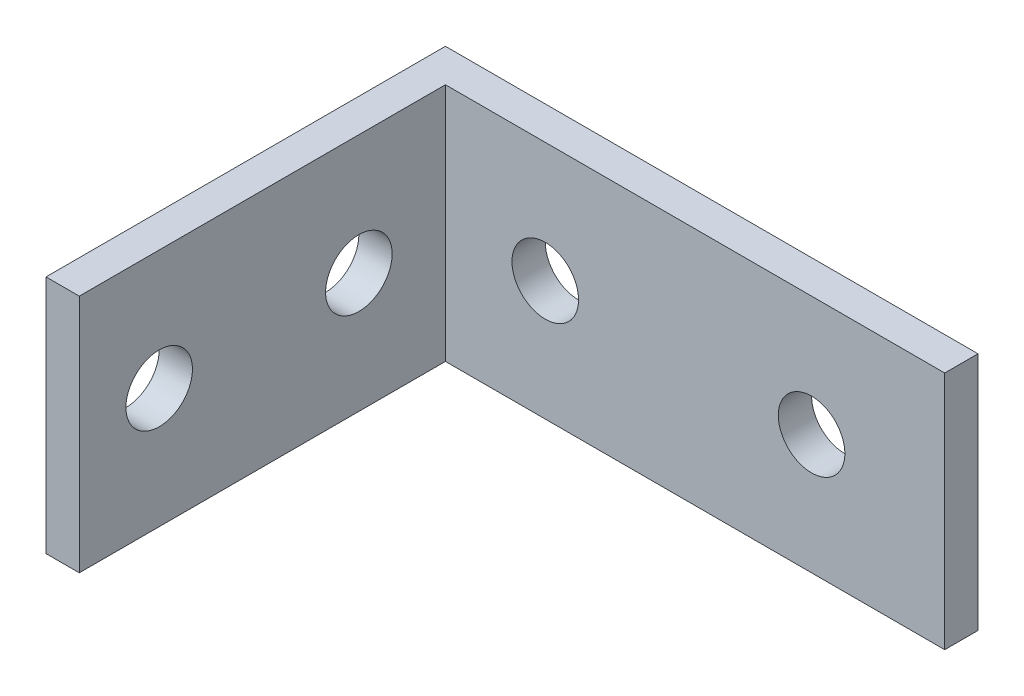
ISO-10303-21;
HEADER;
FILE_DESCRIPTION(('STEP AP214'),'2;1');
FILE_NAME('part.step','',(''),(''),'','','');
FILE_SCHEMA(('AUTOMOTIVE_DESIGN { 1 0 10303 214 1 1 1 1 }'));
ENDSEC;
DATA;
#1=APPLICATION_CONTEXT('core data for automotive mechanical design processes');
#2=APPLICATION_PROTOCOL_DEFINITION('international standard','automotive_design',2000,#1);
#3=PRODUCT_CONTEXT('',#1,'mechanical');
#4=PRODUCT('Part','Part','',(#3));
#5=PRODUCT_RELATED_PRODUCT_CATEGORY('part','',(#4));
#6=PRODUCT_DEFINITION_FORMATION('','',#4);
#7=PRODUCT_DEFINITION_CONTEXT('part definition',#1,'design');
#8=PRODUCT_DEFINITION('design','',#6,#7);
#9=PRODUCT_DEFINITION_SHAPE('','',#8);
#10=(LENGTH_UNIT() NAMED_UNIT(*) SI_UNIT(.MILLI.,.METRE.));
#11=(NAMED_UNIT(*) PLANE_ANGLE_UNIT() SI_UNIT($,.RADIAN.));
#12=(NAMED_UNIT(*) SI_UNIT($,.STERADIAN.) SOLID_ANGLE_UNIT());
#13=UNCERTAINTY_MEASURE_WITH_UNIT(LENGTH_MEASURE(1.E-05),#10,'distance_accuracy_value','');
#14=(GEOMETRIC_REPRESENTATION_CONTEXT(3) GLOBAL_UNCERTAINTY_ASSIGNED_CONTEXT((#13)) GLOBAL_UNIT_ASSIGNED_CONTEXT((#10,
#11,#12)) REPRESENTATION_CONTEXT('',''));
#15=CARTESIAN_POINT('',(0.,0.,0.));
#16=DIRECTION('',(0.,0.,1.));
#17=DIRECTION('',(1.,0.,0.));
#18=AXIS2_PLACEMENT_3D('',#15,#16,#17);
#19=CARTESIAN_POINT('',(3.175,22.86,0.));
#20=DIRECTION('',(-1.,0.,0.));
#21=DIRECTION('',(0.,0.,1.));
#22=AXIS2_PLACEMENT_3D('',#19,#20,#21);
#23=PLANE('',#22);
#24=CARTESIAN_POINT('',(3.175,11.43,-7.62));
#25=DIRECTION('',(1.,0.,0.));
#26=DIRECTION('',(0.,0.,-1.));
#27=AXIS2_PLACEMENT_3D('',#24,#25,#26);
#28=CIRCLE('',#27,3.175);
#29=CARTESIAN_POINT('',(3.175,11.43,-10.795));
#30=VERTEX_POINT('',#29);
#31=EDGE_CURVE('E257',#30,#30,#28,.T.);
#32=ORIENTED_EDGE('',*,*,#31,.F.);
#33=EDGE_LOOP('',(#32));
#34=FACE_BOUND('',#33,.T.);
#35=DIRECTION('',(0.,0.,-1.));
#36=VECTOR('',#35,1.);
#37=CARTESIAN_POINT('',(3.175,0.,0.));
#38=LINE('',#37,#36);
#39=CARTESIAN_POINT('',(3.175,0.,0.));
#40=VERTEX_POINT('',#39);
#41=CARTESIAN_POINT('',(3.175,0.,-34.925));
#42=VERTEX_POINT('',#41);
#43=EDGE_CURVE('E123',#40,#42,#38,.T.);
#44=ORIENTED_EDGE('',*,*,#43,.T.);
#45=DIRECTION('',(0.,-1.,0.));
#46=VECTOR('',#45,1.);
#47=CARTESIAN_POINT('',(3.175,22.86,-34.925));
#48=LINE('',#47,#46);
#49=CARTESIAN_POINT('',(3.175,22.86,-34.925));
#50=VERTEX_POINT('',#49);
#51=EDGE_CURVE('E44',#50,#42,#48,.T.);
#52=ORIENTED_EDGE('',*,*,#51,.F.);
#53=DIRECTION('',(0.,0.,-1.));
#54=VECTOR('',#53,1.);
#55=CARTESIAN_POINT('',(3.175,22.86,0.));
#56=LINE('',#55,#54);
#57=CARTESIAN_POINT('',(3.175,22.86,0.));
#58=VERTEX_POINT('',#57);
#59=EDGE_CURVE('E89',#58,#50,#56,.T.);
#60=ORIENTED_EDGE('',*,*,#59,.F.);
#61=DIRECTION('',(0.,-1.,0.));
#62=VECTOR('',#61,1.);
#63=CARTESIAN_POINT('',(3.175,22.86,0.));
#64=LINE('',#63,#62);
#65=EDGE_CURVE('E11',#58,#40,#64,.T.);
#66=ORIENTED_EDGE('',*,*,#65,.T.);
#67=EDGE_LOOP('',(#44,#52,#60,#66));
#68=FACE_BOUND('',#67,.T.);
#69=CARTESIAN_POINT('',(3.175,11.43,-26.67));
#70=DIRECTION('',(1.,0.,0.));
#71=DIRECTION('',(0.,0.,-1.));
#72=AXIS2_PLACEMENT_3D('',#69,#70,#71);
#73=CIRCLE('',#72,3.175);
#74=CARTESIAN_POINT('',(3.175,11.43,-29.845));
#75=VERTEX_POINT('',#74);
#76=EDGE_CURVE('E252',#75,#75,#73,.T.);
#77=ORIENTED_EDGE('',*,*,#76,.F.);
#78=EDGE_LOOP('',(#77));
#79=FACE_BOUND('',#78,.T.);
#80=ADVANCED_FACE('F35',(#34,#68,#79),#23,.F.);
#81=CARTESIAN_POINT('',(0.,22.86,0.));
#82=DIRECTION('',(0.,0.,-1.));
#83=DIRECTION('',(-1.,0.,0.));
#84=AXIS2_PLACEMENT_3D('',#81,#82,#83);
#85=PLANE('',#84);
#86=DIRECTION('',(1.,0.,0.));
#87=VECTOR('',#86,1.);
#88=CARTESIAN_POINT('',(0.,0.,0.));
#89=LINE('',#88,#87);
#90=CARTESIAN_POINT('',(0.,0.,0.));
#91=VERTEX_POINT('',#90);
#92=EDGE_CURVE('E120',#91,#40,#89,.T.);
#93=ORIENTED_EDGE('',*,*,#92,.T.);
#94=ORIENTED_EDGE('',*,*,#65,.F.);
#95=DIRECTION('',(1.,0.,0.));
#96=VECTOR('',#95,1.);
#97=CARTESIAN_POINT('',(0.,22.86,0.));
#98=LINE('',#97,#96);
#99=CARTESIAN_POINT('',(0.,22.86,0.));
#100=VERTEX_POINT('',#99);
#101=EDGE_CURVE('E131',#100,#58,#98,.T.);
#102=ORIENTED_EDGE('',*,*,#101,.F.);
#103=DIRECTION('',(0.,-1.,0.));
#104=VECTOR('',#103,1.);
#105=CARTESIAN_POINT('',(0.,22.86,0.));
#106=LINE('',#105,#104);
#107=EDGE_CURVE('E116',#100,#91,#106,.T.);
#108=ORIENTED_EDGE('',*,*,#107,.T.);
#109=EDGE_LOOP('',(#93,#94,#102,#108));
#110=FACE_BOUND('',#109,.T.);
#111=ADVANCED_FACE('F37',(#110),#85,.F.);
#112=CARTESIAN_POINT('',(3.175,22.86,-34.925));
#113=DIRECTION('',(0.,0.,-1.));
#114=DIRECTION('',(-1.,0.,0.));
#115=AXIS2_PLACEMENT_3D('',#112,#113,#114);
#116=PLANE('',#115);
#117=CARTESIAN_POINT('',(38.1,11.43,-34.925));
#118=DIRECTION('',(0.,0.,-1.));
#119=DIRECTION('',(-1.,0.,0.));
#120=AXIS2_PLACEMENT_3D('',#117,#118,#119);
#121=CIRCLE('',#120,3.17499999999999);
#122=CARTESIAN_POINT('',(34.925,11.43,-34.925));
#123=VERTEX_POINT('',#122);
#124=EDGE_CURVE('E270',#123,#123,#121,.T.);
#125=ORIENTED_EDGE('',*,*,#124,.T.);
#126=EDGE_LOOP('',(#125));
#127=FACE_BOUND('',#126,.T.);
#128=CARTESIAN_POINT('',(12.7,11.43,-34.925));
#129=DIRECTION('',(0.,0.,-1.));
#130=DIRECTION('',(-1.,0.,0.));
#131=AXIS2_PLACEMENT_3D('',#128,#129,#130);
#132=CIRCLE('',#131,3.17499999999999);
#133=CARTESIAN_POINT('',(9.525,11.43,-34.925));
#134=VERTEX_POINT('',#133);
#135=EDGE_CURVE('E264',#134,#134,#132,.T.);
#136=ORIENTED_EDGE('',*,*,#135,.T.);
#137=EDGE_LOOP('',(#136));
#138=FACE_BOUND('',#137,.T.);
#139=DIRECTION('',(1.,0.,0.));
#140=VECTOR('',#139,1.);
#141=CARTESIAN_POINT('',(3.175,0.,-34.925));
#142=LINE('',#141,#140);
#143=CARTESIAN_POINT('',(50.8,0.,-34.925));
#144=VERTEX_POINT('',#143);
#145=EDGE_CURVE('E126',#42,#144,#142,.T.);
#146=ORIENTED_EDGE('',*,*,#145,.T.);
#147=DIRECTION('',(0.,-1.,0.));
#148=VECTOR('',#147,1.);
#149=CARTESIAN_POINT('',(50.8,22.86,-34.925));
#150=LINE('',#149,#148);
#151=CARTESIAN_POINT('',(50.8,22.86,-34.925));
#152=VERTEX_POINT('',#151);
#153=EDGE_CURVE('E111',#152,#144,#150,.T.);
#154=ORIENTED_EDGE('',*,*,#153,.F.);
#155=DIRECTION('',(1.,0.,0.));
#156=VECTOR('',#155,1.);
#157=CARTESIAN_POINT('',(3.175,22.86,-34.925));
#158=LINE('',#157,#156);
#159=EDGE_CURVE('E102',#50,#152,#158,.T.);
#160=ORIENTED_EDGE('',*,*,#159,.F.);
#161=ORIENTED_EDGE('',*,*,#51,.T.);
#162=EDGE_LOOP('',(#146,#154,#160,#161));
#163=FACE_BOUND('',#162,.T.);
#164=ADVANCED_FACE('F137',(#127,#138,#163),#116,.F.);
#165=CARTESIAN_POINT('',(50.8,22.86,-34.925));
#166=DIRECTION('',(-1.,0.,0.));
#167=DIRECTION('',(0.,0.,1.));
#168=AXIS2_PLACEMENT_3D('',#165,#166,#167);
#169=PLANE('',#168);
#170=DIRECTION('',(0.,0.,-1.));
#171=VECTOR('',#170,1.);
#172=CARTESIAN_POINT('',(50.8,0.,-34.925));
#173=LINE('',#172,#171);
#174=CARTESIAN_POINT('',(50.8,0.,-38.1));
#175=VERTEX_POINT('',#174);
#176=EDGE_CURVE('E110',#144,#175,#173,.T.);
#177=ORIENTED_EDGE('',*,*,#176,.T.);
#178=DIRECTION('',(0.,-1.,0.));
#179=VECTOR('',#178,1.);
#180=CARTESIAN_POINT('',(50.8,22.86,-38.1));
#181=LINE('',#180,#179);
#182=CARTESIAN_POINT('',(50.8,22.86,-38.1));
#183=VERTEX_POINT('',#182);
#184=EDGE_CURVE('E107',#183,#175,#181,.T.);
#185=ORIENTED_EDGE('',*,*,#184,.F.);
#186=DIRECTION('',(0.,0.,-1.));
#187=VECTOR('',#186,1.);
#188=CARTESIAN_POINT('',(50.8,22.86,-34.925));
#189=LINE('',#188,#187);
#190=EDGE_CURVE('E96',#152,#183,#189,.T.);
#191=ORIENTED_EDGE('',*,*,#190,.F.);
#192=ORIENTED_EDGE('',*,*,#153,.T.);
#193=EDGE_LOOP('',(#177,#185,#191,#192));
#194=FACE_BOUND('',#193,.T.);
#195=ADVANCED_FACE('F108',(#194),#169,.F.);
#196=CARTESIAN_POINT('',(0.,22.86,-38.1));
#197=DIRECTION('',(0.,0.,1.));
#198=DIRECTION('',(1.,0.,0.));
#199=AXIS2_PLACEMENT_3D('',#196,#197,#198);
#200=PLANE('',#199);
#201=CARTESIAN_POINT('',(38.1,11.43,-38.1));
#202=DIRECTION('',(0.,0.,-1.));
#203=DIRECTION('',(-1.,0.,0.));
#204=AXIS2_PLACEMENT_3D('',#201,#202,#203);
#205=CIRCLE('',#204,3.17499999999998);
#206=CARTESIAN_POINT('',(34.925,11.43,-38.1));
#207=VERTEX_POINT('',#206);
#208=EDGE_CURVE('E273',#207,#207,#205,.T.);
#209=ORIENTED_EDGE('',*,*,#208,.F.);
#210=EDGE_LOOP('',(#209));
#211=FACE_BOUND('',#210,.T.);
#212=CARTESIAN_POINT('',(12.7,11.43,-38.1));
#213=DIRECTION('',(0.,0.,-1.));
#214=DIRECTION('',(-1.,0.,0.));
#215=AXIS2_PLACEMENT_3D('',#212,#213,#214);
#216=CIRCLE('',#215,3.17499999999999);
#217=CARTESIAN_POINT('',(9.52500000000001,11.43,-38.1));
#218=VERTEX_POINT('',#217);
#219=EDGE_CURVE('E267',#218,#218,#216,.T.);
#220=ORIENTED_EDGE('',*,*,#219,.F.);
#221=EDGE_LOOP('',(#220));
#222=FACE_BOUND('',#221,.T.);
#223=DIRECTION('',(-1.,0.,0.));
#224=VECTOR('',#223,1.);
#225=CARTESIAN_POINT('',(0.,0.,-38.1));
#226=LINE('',#225,#224);
#227=CARTESIAN_POINT('',(0.,0.,-38.1));
#228=VERTEX_POINT('',#227);
#229=EDGE_CURVE('E75',#175,#228,#226,.T.);
#230=ORIENTED_EDGE('',*,*,#229,.T.);
#231=DIRECTION('',(0.,-1.,0.));
#232=VECTOR('',#231,1.);
#233=CARTESIAN_POINT('',(0.,22.86,-38.1));
#234=LINE('',#233,#232);
#235=CARTESIAN_POINT('',(0.,22.86,-38.1));
#236=VERTEX_POINT('',#235);
#237=EDGE_CURVE('E112',#236,#228,#234,.T.);
#238=ORIENTED_EDGE('',*,*,#237,.F.);
#239=DIRECTION('',(-1.,0.,0.));
#240=VECTOR('',#239,1.);
#241=CARTESIAN_POINT('',(0.,22.86,-38.1));
#242=LINE('',#241,#240);
#243=EDGE_CURVE('E100',#183,#236,#242,.T.);
#244=ORIENTED_EDGE('',*,*,#243,.F.);
#245=ORIENTED_EDGE('',*,*,#184,.T.);
#246=EDGE_LOOP('',(#230,#238,#244,#245));
#247=FACE_BOUND('',#246,.T.);
#248=ADVANCED_FACE('F114',(#211,#222,#247),#200,.F.);
#249=CARTESIAN_POINT('',(0.,22.86,0.));
#250=DIRECTION('',(1.,0.,0.));
#251=DIRECTION('',(0.,0.,-1.));
#252=AXIS2_PLACEMENT_3D('',#249,#250,#251);
#253=PLANE('',#252);
#254=CARTESIAN_POINT('',(0.,11.43,-7.62));
#255=DIRECTION('',(1.,0.,0.));
#256=DIRECTION('',(0.,0.,-1.));
#257=AXIS2_PLACEMENT_3D('',#254,#255,#256);
#258=CIRCLE('',#257,3.175);
#259=CARTESIAN_POINT('',(0.,11.43,-10.795));
#260=VERTEX_POINT('',#259);
#261=EDGE_CURVE('E254',#260,#260,#258,.T.);
#262=ORIENTED_EDGE('',*,*,#261,.T.);
#263=EDGE_LOOP('',(#262));
#264=FACE_BOUND('',#263,.T.);
#265=CARTESIAN_POINT('',(0.,11.43,-26.67));
#266=DIRECTION('',(1.,0.,0.));
#267=DIRECTION('',(0.,0.,-1.));
#268=AXIS2_PLACEMENT_3D('',#265,#266,#267);
#269=CIRCLE('',#268,3.175);
#270=CARTESIAN_POINT('',(0.,11.43,-29.845));
#271=VERTEX_POINT('',#270);
#272=EDGE_CURVE('E124',#271,#271,#269,.T.);
#273=ORIENTED_EDGE('',*,*,#272,.T.);
#274=EDGE_LOOP('',(#273));
#275=FACE_BOUND('',#274,.T.);
#276=DIRECTION('',(0.,0.,1.));
#277=VECTOR('',#276,1.);
#278=CARTESIAN_POINT('',(0.,0.,0.));
#279=LINE('',#278,#277);
#280=EDGE_CURVE('E81',#228,#91,#279,.T.);
#281=ORIENTED_EDGE('',*,*,#280,.T.);
#282=ORIENTED_EDGE('',*,*,#107,.F.);
#283=DIRECTION('',(0.,0.,1.));
#284=VECTOR('',#283,1.);
#285=CARTESIAN_POINT('',(0.,22.86,0.));
#286=LINE('',#285,#284);
#287=EDGE_CURVE('E52',#236,#100,#286,.T.);
#288=ORIENTED_EDGE('',*,*,#287,.F.);
#289=ORIENTED_EDGE('',*,*,#237,.T.);
#290=EDGE_LOOP('',(#281,#282,#288,#289));
#291=FACE_BOUND('',#290,.T.);
#292=ADVANCED_FACE('F144',(#264,#275,#291),#253,.F.);
#293=CARTESIAN_POINT('',(0.,22.86,0.));
#294=DIRECTION('',(0.,1.,0.));
#295=DIRECTION('',(0.,0.,1.));
#296=AXIS2_PLACEMENT_3D('',#293,#294,#295);
#297=PLANE('',#296);
#298=ORIENTED_EDGE('',*,*,#101,.T.);
#299=ORIENTED_EDGE('',*,*,#59,.T.);
#300=ORIENTED_EDGE('',*,*,#159,.T.);
#301=ORIENTED_EDGE('',*,*,#190,.T.);
#302=ORIENTED_EDGE('',*,*,#243,.T.);
#303=ORIENTED_EDGE('',*,*,#287,.T.);
#304=EDGE_LOOP('',(#298,#299,#300,#301,#302,#303));
#305=FACE_BOUND('',#304,.T.);
#306=ADVANCED_FACE('F98',(#305),#297,.T.);
#307=CARTESIAN_POINT('',(0.,0.,0.));
#308=DIRECTION('',(0.,1.,0.));
#309=DIRECTION('',(0.,0.,1.));
#310=AXIS2_PLACEMENT_3D('',#307,#308,#309);
#311=PLANE('',#310);
#312=ORIENTED_EDGE('',*,*,#92,.F.);
#313=ORIENTED_EDGE('',*,*,#280,.F.);
#314=ORIENTED_EDGE('',*,*,#229,.F.);
#315=ORIENTED_EDGE('',*,*,#176,.F.);
#316=ORIENTED_EDGE('',*,*,#145,.F.);
#317=ORIENTED_EDGE('',*,*,#43,.F.);
#318=EDGE_LOOP('',(#312,#313,#314,#315,#316,#317));
#319=FACE_BOUND('',#318,.T.);
#320=ADVANCED_FACE('F140',(#319),#311,.F.);
#321=CARTESIAN_POINT('',(3.175,11.43,-26.67));
#322=DIRECTION('',(1.,0.,0.));
#323=DIRECTION('',(0.,0.,-1.));
#324=AXIS2_PLACEMENT_3D('',#321,#322,#323);
#325=CYLINDRICAL_SURFACE('',#324,3.175);
#326=ORIENTED_EDGE('',*,*,#272,.F.);
#327=EDGE_LOOP('',(#326));
#328=FACE_BOUND('',#327,.T.);
#329=ORIENTED_EDGE('',*,*,#76,.T.);
#330=EDGE_LOOP('',(#329));
#331=FACE_BOUND('',#330,.T.);
#332=ADVANCED_FACE('F214',(#328,#331),#325,.F.);
#333=CARTESIAN_POINT('',(3.175,11.43,-7.62));
#334=DIRECTION('',(1.,0.,0.));
#335=DIRECTION('',(0.,0.,-1.));
#336=AXIS2_PLACEMENT_3D('',#333,#334,#335);
#337=CYLINDRICAL_SURFACE('',#336,3.175);
#338=ORIENTED_EDGE('',*,*,#261,.F.);
#339=EDGE_LOOP('',(#338));
#340=FACE_BOUND('',#339,.T.);
#341=ORIENTED_EDGE('',*,*,#31,.T.);
#342=EDGE_LOOP('',(#341));
#343=FACE_BOUND('',#342,.T.);
#344=ADVANCED_FACE('F194',(#340,#343),#337,.F.);
#345=CARTESIAN_POINT('',(12.7,11.43,-38.1));
#346=DIRECTION('',(0.,0.,-1.));
#347=DIRECTION('',(-1.,0.,0.));
#348=AXIS2_PLACEMENT_3D('',#345,#346,#347);
#349=CYLINDRICAL_SURFACE('',#348,3.17499999999999);
#350=ORIENTED_EDGE('',*,*,#135,.F.);
#351=EDGE_LOOP('',(#350));
#352=FACE_BOUND('',#351,.T.);
#353=ORIENTED_EDGE('',*,*,#219,.T.);
#354=EDGE_LOOP('',(#353));
#355=FACE_BOUND('',#354,.T.);
#356=ADVANCED_FACE('F188',(#352,#355),#349,.F.);
#357=CARTESIAN_POINT('',(38.1,11.43,-38.1));
#358=DIRECTION('',(0.,0.,-1.));
#359=DIRECTION('',(-1.,0.,0.));
#360=AXIS2_PLACEMENT_3D('',#357,#358,#359);
#361=CYLINDRICAL_SURFACE('',#360,3.17499999999999);
#362=ORIENTED_EDGE('',*,*,#124,.F.);
#363=EDGE_LOOP('',(#362));
#364=FACE_BOUND('',#363,.T.);
#365=ORIENTED_EDGE('',*,*,#208,.T.);
#366=EDGE_LOOP('',(#365));
#367=FACE_BOUND('',#366,.T.);
#368=ADVANCED_FACE('F193',(#364,#367),#361,.F.);
#369=CLOSED_SHELL('',(#80,#111,#164,#195,#248,#292,#306,#320,#332,#344,#356,#368));
#370=MANIFOLD_SOLID_BREP('B2',#369);
#371=ADVANCED_BREP_SHAPE_REPRESENTATION('',(#18,#370),#14);
#372=SHAPE_DEFINITION_REPRESENTATION(#9,#371);
ENDSEC;
END-ISO-10303-21;
